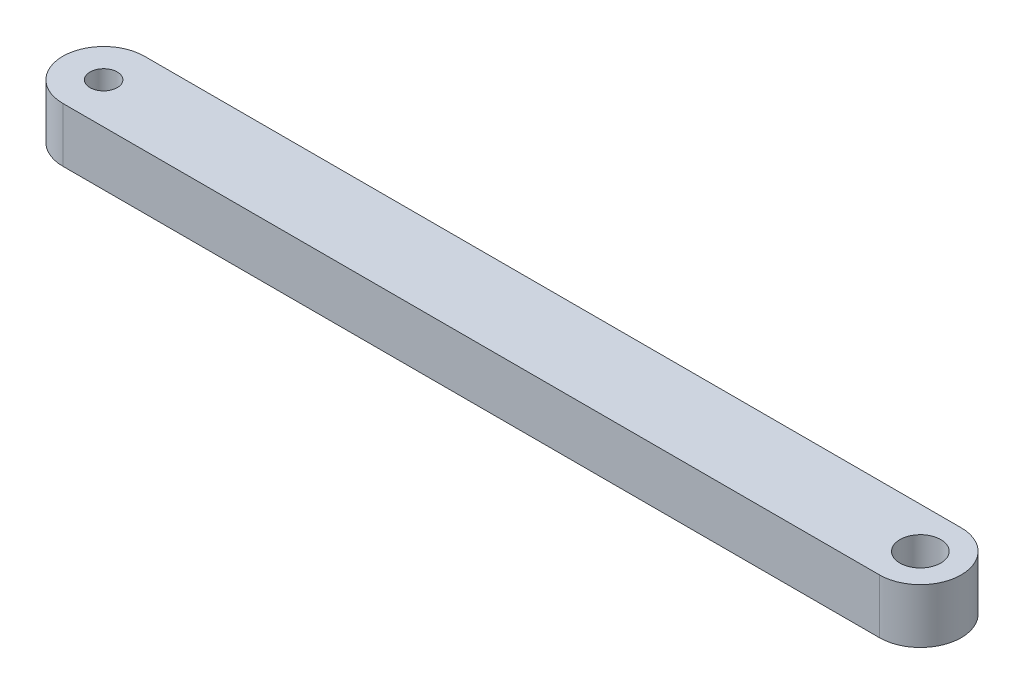
ISO-10303-21;
HEADER;
FILE_DESCRIPTION(('STEP AP214'),'2;1');
FILE_NAME('part.step','',(''),(''),'','','');
FILE_SCHEMA(('AUTOMOTIVE_DESIGN { 1 0 10303 214 1 1 1 1 }'));
ENDSEC;
DATA;
#1=APPLICATION_CONTEXT('core data for automotive mechanical design processes');
#2=APPLICATION_PROTOCOL_DEFINITION('international standard','automotive_design',2000,#1);
#3=PRODUCT_CONTEXT('',#1,'mechanical');
#4=PRODUCT('Part','Part','',(#3));
#5=PRODUCT_RELATED_PRODUCT_CATEGORY('part','',(#4));
#6=PRODUCT_DEFINITION_FORMATION('','',#4);
#7=PRODUCT_DEFINITION_CONTEXT('part definition',#1,'design');
#8=PRODUCT_DEFINITION('design','',#6,#7);
#9=PRODUCT_DEFINITION_SHAPE('','',#8);
#10=(LENGTH_UNIT() NAMED_UNIT(*) SI_UNIT(.MILLI.,.METRE.));
#11=(NAMED_UNIT(*) PLANE_ANGLE_UNIT() SI_UNIT($,.RADIAN.));
#12=(NAMED_UNIT(*) SI_UNIT($,.STERADIAN.) SOLID_ANGLE_UNIT());
#13=UNCERTAINTY_MEASURE_WITH_UNIT(LENGTH_MEASURE(1.E-05),#10,'distance_accuracy_value','');
#14=(GEOMETRIC_REPRESENTATION_CONTEXT(3) GLOBAL_UNCERTAINTY_ASSIGNED_CONTEXT((#13)) GLOBAL_UNIT_ASSIGNED_CONTEXT((#10,
#11,#12)) REPRESENTATION_CONTEXT('',''));
#15=CARTESIAN_POINT('',(0.,0.,0.));
#16=DIRECTION('',(0.,0.,1.));
#17=DIRECTION('',(1.,0.,0.));
#18=AXIS2_PLACEMENT_3D('',#15,#16,#17);
#19=CARTESIAN_POINT('',(30.,4.,0.));
#20=DIRECTION('',(0.,1.,0.));
#21=DIRECTION('',(0.,0.,1.));
#22=AXIS2_PLACEMENT_3D('',#19,#20,#21);
#23=PLANE('',#22);
#24=CARTESIAN_POINT('',(-30.,4.,0.));
#25=DIRECTION('',(0.,1.,0.));
#26=DIRECTION('',(0.,0.,1.));
#27=AXIS2_PLACEMENT_3D('',#24,#25,#26);
#28=CIRCLE('',#27,0.999999999999998);
#29=CARTESIAN_POINT('',(-30.,4.,1.));
#30=VERTEX_POINT('',#29);
#31=EDGE_CURVE('E101',#30,#30,#28,.T.);
#32=ORIENTED_EDGE('',*,*,#31,.F.);
#33=EDGE_LOOP('',(#32));
#34=FACE_BOUND('',#33,.T.);
#35=CARTESIAN_POINT('',(30.,4.,0.));
#36=DIRECTION('',(0.,1.,0.));
#37=DIRECTION('',(0.,0.,1.));
#38=AXIS2_PLACEMENT_3D('',#35,#36,#37);
#39=CIRCLE('',#38,2.99999999999999);
#40=CARTESIAN_POINT('',(30.,4.,2.99999999999999));
#41=VERTEX_POINT('',#40);
#42=CARTESIAN_POINT('',(30.,4.,-2.99999999999999));
#43=VERTEX_POINT('',#42);
#44=EDGE_CURVE('E86',#41,#43,#39,.T.);
#45=ORIENTED_EDGE('',*,*,#44,.T.);
#46=DIRECTION('',(-1.,0.,0.));
#47=VECTOR('',#46,1.);
#48=CARTESIAN_POINT('',(-30.,4.,-2.99999999999999));
#49=LINE('',#48,#47);
#50=CARTESIAN_POINT('',(-30.,4.,-2.99999999999999));
#51=VERTEX_POINT('',#50);
#52=EDGE_CURVE('E81',#43,#51,#49,.T.);
#53=ORIENTED_EDGE('',*,*,#52,.T.);
#54=CARTESIAN_POINT('',(-30.,4.,0.));
#55=DIRECTION('',(0.,1.,0.));
#56=DIRECTION('',(0.,0.,1.));
#57=AXIS2_PLACEMENT_3D('',#54,#55,#56);
#58=CIRCLE('',#57,3.);
#59=CARTESIAN_POINT('',(-30.,4.,3.00000000000001));
#60=VERTEX_POINT('',#59);
#61=EDGE_CURVE('E84',#51,#60,#58,.T.);
#62=ORIENTED_EDGE('',*,*,#61,.T.);
#63=DIRECTION('',(1.,0.,0.));
#64=VECTOR('',#63,1.);
#65=CARTESIAN_POINT('',(-30.,4.,3.00000000000001));
#66=LINE('',#65,#64);
#67=EDGE_CURVE('E51',#60,#41,#66,.T.);
#68=ORIENTED_EDGE('',*,*,#67,.T.);
#69=EDGE_LOOP('',(#45,#53,#62,#68));
#70=FACE_BOUND('',#69,.T.);
#71=CARTESIAN_POINT('',(30.,4.,0.));
#72=DIRECTION('',(0.,1.,0.));
#73=DIRECTION('',(0.,0.,1.));
#74=AXIS2_PLACEMENT_3D('',#71,#72,#73);
#75=CIRCLE('',#74,1.5);
#76=CARTESIAN_POINT('',(30.,4.,1.5));
#77=VERTEX_POINT('',#76);
#78=EDGE_CURVE('E116',#77,#77,#75,.T.);
#79=ORIENTED_EDGE('',*,*,#78,.F.);
#80=EDGE_LOOP('',(#79));
#81=FACE_BOUND('',#80,.T.);
#82=ADVANCED_FACE('F34',(#34,#70,#81),#23,.T.);
#83=CARTESIAN_POINT('',(30.,0.,0.));
#84=DIRECTION('',(0.,1.,0.));
#85=DIRECTION('',(0.,0.,1.));
#86=AXIS2_PLACEMENT_3D('',#83,#84,#85);
#87=PLANE('',#86);
#88=CARTESIAN_POINT('',(30.,0.,0.));
#89=DIRECTION('',(0.,1.,0.));
#90=DIRECTION('',(0.,0.,1.));
#91=AXIS2_PLACEMENT_3D('',#88,#89,#90);
#92=CIRCLE('',#91,2.99999999999999);
#93=CARTESIAN_POINT('',(30.,0.,2.99999999999999));
#94=VERTEX_POINT('',#93);
#95=CARTESIAN_POINT('',(30.,0.,-2.99999999999999));
#96=VERTEX_POINT('',#95);
#97=EDGE_CURVE('E98',#94,#96,#92,.T.);
#98=ORIENTED_EDGE('',*,*,#97,.F.);
#99=DIRECTION('',(1.,0.,0.));
#100=VECTOR('',#99,1.);
#101=CARTESIAN_POINT('',(-30.,0.,3.00000000000001));
#102=LINE('',#101,#100);
#103=CARTESIAN_POINT('',(-30.,0.,3.00000000000001));
#104=VERTEX_POINT('',#103);
#105=EDGE_CURVE('E74',#104,#94,#102,.T.);
#106=ORIENTED_EDGE('',*,*,#105,.F.);
#107=CARTESIAN_POINT('',(-30.,0.,0.));
#108=DIRECTION('',(0.,1.,0.));
#109=DIRECTION('',(0.,0.,1.));
#110=AXIS2_PLACEMENT_3D('',#107,#108,#109);
#111=CIRCLE('',#110,3.);
#112=CARTESIAN_POINT('',(-30.,0.,-2.99999999999999));
#113=VERTEX_POINT('',#112);
#114=EDGE_CURVE('E68',#113,#104,#111,.T.);
#115=ORIENTED_EDGE('',*,*,#114,.F.);
#116=DIRECTION('',(-1.,0.,0.));
#117=VECTOR('',#116,1.);
#118=CARTESIAN_POINT('',(-30.,0.,-2.99999999999999));
#119=LINE('',#118,#117);
#120=EDGE_CURVE('E90',#96,#113,#119,.T.);
#121=ORIENTED_EDGE('',*,*,#120,.F.);
#122=EDGE_LOOP('',(#98,#106,#115,#121));
#123=FACE_BOUND('',#122,.T.);
#124=CARTESIAN_POINT('',(-30.,0.,0.));
#125=DIRECTION('',(0.,1.,0.));
#126=DIRECTION('',(0.,0.,1.));
#127=AXIS2_PLACEMENT_3D('',#124,#125,#126);
#128=CIRCLE('',#127,0.999999999999998);
#129=CARTESIAN_POINT('',(-30.,0.,1.));
#130=VERTEX_POINT('',#129);
#131=EDGE_CURVE('E113',#130,#130,#128,.T.);
#132=ORIENTED_EDGE('',*,*,#131,.T.);
#133=EDGE_LOOP('',(#132));
#134=FACE_BOUND('',#133,.T.);
#135=CARTESIAN_POINT('',(30.,0.,0.));
#136=DIRECTION('',(0.,1.,0.));
#137=DIRECTION('',(0.,0.,1.));
#138=AXIS2_PLACEMENT_3D('',#135,#136,#137);
#139=CIRCLE('',#138,1.5);
#140=CARTESIAN_POINT('',(30.,0.,1.5));
#141=VERTEX_POINT('',#140);
#142=EDGE_CURVE('E119',#141,#141,#139,.T.);
#143=ORIENTED_EDGE('',*,*,#142,.T.);
#144=EDGE_LOOP('',(#143));
#145=FACE_BOUND('',#144,.T.);
#146=ADVANCED_FACE('F109',(#123,#134,#145),#87,.F.);
#147=CARTESIAN_POINT('',(30.,4.,0.));
#148=DIRECTION('',(0.,-1.,0.));
#149=DIRECTION('',(0.,0.,-1.));
#150=AXIS2_PLACEMENT_3D('',#147,#148,#149);
#151=CYLINDRICAL_SURFACE('',#150,2.99999999999999);
#152=ORIENTED_EDGE('',*,*,#97,.T.);
#153=DIRECTION('',(0.,-1.,0.));
#154=VECTOR('',#153,1.);
#155=CARTESIAN_POINT('',(30.,4.,-2.99999999999999));
#156=LINE('',#155,#154);
#157=EDGE_CURVE('E11',#43,#96,#156,.T.);
#158=ORIENTED_EDGE('',*,*,#157,.F.);
#159=ORIENTED_EDGE('',*,*,#44,.F.);
#160=DIRECTION('',(0.,-1.,0.));
#161=VECTOR('',#160,1.);
#162=CARTESIAN_POINT('',(30.,4.,2.99999999999999));
#163=LINE('',#162,#161);
#164=EDGE_CURVE('E94',#41,#94,#163,.T.);
#165=ORIENTED_EDGE('',*,*,#164,.T.);
#166=EDGE_LOOP('',(#152,#158,#159,#165));
#167=FACE_BOUND('',#166,.T.);
#168=ADVANCED_FACE('F36',(#167),#151,.T.);
#169=CARTESIAN_POINT('',(-30.,4.,-2.99999999999999));
#170=DIRECTION('',(0.,0.,1.));
#171=DIRECTION('',(1.,0.,0.));
#172=AXIS2_PLACEMENT_3D('',#169,#170,#171);
#173=PLANE('',#172);
#174=ORIENTED_EDGE('',*,*,#120,.T.);
#175=DIRECTION('',(0.,-1.,0.));
#176=VECTOR('',#175,1.);
#177=CARTESIAN_POINT('',(-30.,4.,-2.99999999999999));
#178=LINE('',#177,#176);
#179=EDGE_CURVE('E43',#51,#113,#178,.T.);
#180=ORIENTED_EDGE('',*,*,#179,.F.);
#181=ORIENTED_EDGE('',*,*,#52,.F.);
#182=ORIENTED_EDGE('',*,*,#157,.T.);
#183=EDGE_LOOP('',(#174,#180,#181,#182));
#184=FACE_BOUND('',#183,.T.);
#185=ADVANCED_FACE('F89',(#184),#173,.F.);
#186=CARTESIAN_POINT('',(-30.,4.,0.));
#187=DIRECTION('',(0.,-1.,0.));
#188=DIRECTION('',(0.,0.,-1.));
#189=AXIS2_PLACEMENT_3D('',#186,#187,#188);
#190=CYLINDRICAL_SURFACE('',#189,3.);
#191=ORIENTED_EDGE('',*,*,#114,.T.);
#192=DIRECTION('',(0.,-1.,0.));
#193=VECTOR('',#192,1.);
#194=CARTESIAN_POINT('',(-30.,4.,3.00000000000001));
#195=LINE('',#194,#193);
#196=EDGE_CURVE('E91',#60,#104,#195,.T.);
#197=ORIENTED_EDGE('',*,*,#196,.F.);
#198=ORIENTED_EDGE('',*,*,#61,.F.);
#199=ORIENTED_EDGE('',*,*,#179,.T.);
#200=EDGE_LOOP('',(#191,#197,#198,#199));
#201=FACE_BOUND('',#200,.T.);
#202=ADVANCED_FACE('F92',(#201),#190,.T.);
#203=CARTESIAN_POINT('',(-30.,4.,3.00000000000001));
#204=DIRECTION('',(0.,0.,-1.));
#205=DIRECTION('',(-1.,0.,0.));
#206=AXIS2_PLACEMENT_3D('',#203,#204,#205);
#207=PLANE('',#206);
#208=ORIENTED_EDGE('',*,*,#105,.T.);
#209=ORIENTED_EDGE('',*,*,#164,.F.);
#210=ORIENTED_EDGE('',*,*,#67,.F.);
#211=ORIENTED_EDGE('',*,*,#196,.T.);
#212=EDGE_LOOP('',(#208,#209,#210,#211));
#213=FACE_BOUND('',#212,.T.);
#214=ADVANCED_FACE('F106',(#213),#207,.F.);
#215=CARTESIAN_POINT('',(-30.,4.,0.));
#216=DIRECTION('',(0.,-1.,0.));
#217=DIRECTION('',(0.,0.,-1.));
#218=AXIS2_PLACEMENT_3D('',#215,#216,#217);
#219=CYLINDRICAL_SURFACE('',#218,0.999999999999998);
#220=ORIENTED_EDGE('',*,*,#31,.T.);
#221=EDGE_LOOP('',(#220));
#222=FACE_BOUND('',#221,.T.);
#223=ORIENTED_EDGE('',*,*,#131,.F.);
#224=EDGE_LOOP('',(#223));
#225=FACE_BOUND('',#224,.T.);
#226=ADVANCED_FACE('F136',(#222,#225),#219,.F.);
#227=CARTESIAN_POINT('',(30.,4.,0.));
#228=DIRECTION('',(0.,-1.,0.));
#229=DIRECTION('',(0.,0.,-1.));
#230=AXIS2_PLACEMENT_3D('',#227,#228,#229);
#231=CYLINDRICAL_SURFACE('',#230,1.5);
#232=ORIENTED_EDGE('',*,*,#78,.T.);
#233=EDGE_LOOP('',(#232));
#234=FACE_BOUND('',#233,.T.);
#235=ORIENTED_EDGE('',*,*,#142,.F.);
#236=EDGE_LOOP('',(#235));
#237=FACE_BOUND('',#236,.T.);
#238=ADVANCED_FACE('F125',(#234,#237),#231,.F.);
#239=CLOSED_SHELL('',(#82,#146,#168,#185,#202,#214,#226,#238));
#240=MANIFOLD_SOLID_BREP('B2',#239);
#241=ADVANCED_BREP_SHAPE_REPRESENTATION('',(#18,#240),#14);
#242=SHAPE_DEFINITION_REPRESENTATION(#9,#241);
ENDSEC;
END-ISO-10303-21;
